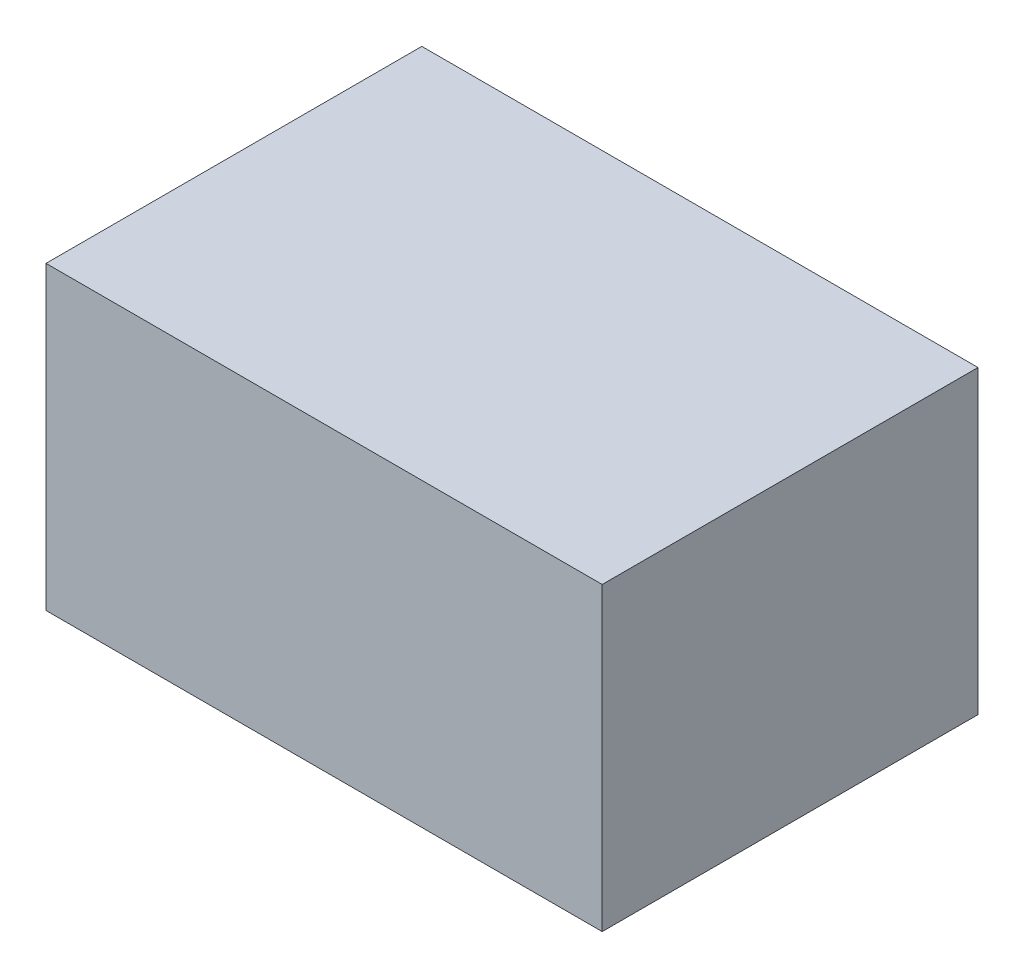
ISO-10303-21;
HEADER;
FILE_DESCRIPTION(('STEP AP214'),'2;1');
FILE_NAME('part.step','',(''),(''),'','','');
FILE_SCHEMA(('AUTOMOTIVE_DESIGN { 1 0 10303 214 1 1 1 1 }'));
ENDSEC;
DATA;
#1=APPLICATION_CONTEXT('core data for automotive mechanical design processes');
#2=APPLICATION_PROTOCOL_DEFINITION('international standard','automotive_design',2000,#1);
#3=PRODUCT_CONTEXT('',#1,'mechanical');
#4=PRODUCT('Part','Part','',(#3));
#5=PRODUCT_RELATED_PRODUCT_CATEGORY('part','',(#4));
#6=PRODUCT_DEFINITION_FORMATION('','',#4);
#7=PRODUCT_DEFINITION_CONTEXT('part definition',#1,'design');
#8=PRODUCT_DEFINITION('design','',#6,#7);
#9=PRODUCT_DEFINITION_SHAPE('','',#8);
#10=(LENGTH_UNIT() NAMED_UNIT(*) SI_UNIT(.MILLI.,.METRE.));
#11=(NAMED_UNIT(*) PLANE_ANGLE_UNIT() SI_UNIT($,.RADIAN.));
#12=(NAMED_UNIT(*) SI_UNIT($,.STERADIAN.) SOLID_ANGLE_UNIT());
#13=UNCERTAINTY_MEASURE_WITH_UNIT(LENGTH_MEASURE(1.E-05),#10,'distance_accuracy_value','');
#14=(GEOMETRIC_REPRESENTATION_CONTEXT(3) GLOBAL_UNCERTAINTY_ASSIGNED_CONTEXT((#13)) GLOBAL_UNIT_ASSIGNED_CONTEXT((#10,
#11,#12)) REPRESENTATION_CONTEXT('',''));
#15=CARTESIAN_POINT('',(0.,0.,0.));
#16=DIRECTION('',(0.,0.,1.));
#17=DIRECTION('',(1.,0.,0.));
#18=AXIS2_PLACEMENT_3D('',#15,#16,#17);
#19=CARTESIAN_POINT('',(37.,0.,0.));
#20=DIRECTION('',(0.,0.,-1.));
#21=DIRECTION('',(-1.,0.,0.));
#22=AXIS2_PLACEMENT_3D('',#19,#20,#21);
#23=PLANE('',#22);
#24=DIRECTION('',(0.,-1.,0.));
#25=VECTOR('',#24,1.);
#26=CARTESIAN_POINT('',(-37.,0.,0.));
#27=LINE('',#26,#25);
#28=CARTESIAN_POINT('',(-37.,40.,0.));
#29=VERTEX_POINT('',#28);
#30=CARTESIAN_POINT('',(-37.,0.,0.));
#31=VERTEX_POINT('',#30);
#32=EDGE_CURVE('E99',#29,#31,#27,.T.);
#33=ORIENTED_EDGE('',*,*,#32,.T.);
#34=DIRECTION('',(-1.,0.,0.));
#35=VECTOR('',#34,1.);
#36=CARTESIAN_POINT('',(37.,0.,0.));
#37=LINE('',#36,#35);
#38=CARTESIAN_POINT('',(37.,0.,0.));
#39=VERTEX_POINT('',#38);
#40=EDGE_CURVE('E11',#39,#31,#37,.T.);
#41=ORIENTED_EDGE('',*,*,#40,.F.);
#42=DIRECTION('',(0.,-1.,0.));
#43=VECTOR('',#42,1.);
#44=CARTESIAN_POINT('',(37.,0.,0.));
#45=LINE('',#44,#43);
#46=CARTESIAN_POINT('',(37.,40.,0.));
#47=VERTEX_POINT('',#46);
#48=EDGE_CURVE('E87',#47,#39,#45,.T.);
#49=ORIENTED_EDGE('',*,*,#48,.F.);
#50=DIRECTION('',(-1.,0.,0.));
#51=VECTOR('',#50,1.);
#52=CARTESIAN_POINT('',(37.,40.,0.));
#53=LINE('',#52,#51);
#54=EDGE_CURVE('E95',#47,#29,#53,.T.);
#55=ORIENTED_EDGE('',*,*,#54,.T.);
#56=EDGE_LOOP('',(#33,#41,#49,#55));
#57=FACE_BOUND('',#56,.T.);
#58=ADVANCED_FACE('F36',(#57),#23,.F.);
#59=CARTESIAN_POINT('',(37.,0.,0.));
#60=DIRECTION('',(0.,1.,0.));
#61=DIRECTION('',(0.,0.,1.));
#62=AXIS2_PLACEMENT_3D('',#59,#60,#61);
#63=PLANE('',#62);
#64=DIRECTION('',(0.,0.,-1.));
#65=VECTOR('',#64,1.);
#66=CARTESIAN_POINT('',(-37.,0.,0.));
#67=LINE('',#66,#65);
#68=CARTESIAN_POINT('',(-37.,0.,-50.));
#69=VERTEX_POINT('',#68);
#70=EDGE_CURVE('E91',#31,#69,#67,.T.);
#71=ORIENTED_EDGE('',*,*,#70,.T.);
#72=DIRECTION('',(-1.,0.,0.));
#73=VECTOR('',#72,1.);
#74=CARTESIAN_POINT('',(37.,0.,-50.));
#75=LINE('',#74,#73);
#76=CARTESIAN_POINT('',(37.,0.,-50.));
#77=VERTEX_POINT('',#76);
#78=EDGE_CURVE('E44',#77,#69,#75,.T.);
#79=ORIENTED_EDGE('',*,*,#78,.F.);
#80=DIRECTION('',(0.,0.,-1.));
#81=VECTOR('',#80,1.);
#82=CARTESIAN_POINT('',(37.,0.,0.));
#83=LINE('',#82,#81);
#84=EDGE_CURVE('E82',#39,#77,#83,.T.);
#85=ORIENTED_EDGE('',*,*,#84,.F.);
#86=ORIENTED_EDGE('',*,*,#40,.T.);
#87=EDGE_LOOP('',(#71,#79,#85,#86));
#88=FACE_BOUND('',#87,.T.);
#89=ADVANCED_FACE('F90',(#88),#63,.F.);
#90=CARTESIAN_POINT('',(37.,0.,-50.));
#91=DIRECTION('',(0.,0.,1.));
#92=DIRECTION('',(1.,0.,0.));
#93=AXIS2_PLACEMENT_3D('',#90,#91,#92);
#94=PLANE('',#93);
#95=DIRECTION('',(0.,1.,0.));
#96=VECTOR('',#95,1.);
#97=CARTESIAN_POINT('',(-37.,0.,-50.));
#98=LINE('',#97,#96);
#99=CARTESIAN_POINT('',(-37.,40.,-50.));
#100=VERTEX_POINT('',#99);
#101=EDGE_CURVE('E69',#69,#100,#98,.T.);
#102=ORIENTED_EDGE('',*,*,#101,.T.);
#103=DIRECTION('',(-1.,0.,0.));
#104=VECTOR('',#103,1.);
#105=CARTESIAN_POINT('',(37.,40.,-50.));
#106=LINE('',#105,#104);
#107=CARTESIAN_POINT('',(37.,40.,-50.));
#108=VERTEX_POINT('',#107);
#109=EDGE_CURVE('E92',#108,#100,#106,.T.);
#110=ORIENTED_EDGE('',*,*,#109,.F.);
#111=DIRECTION('',(0.,1.,0.));
#112=VECTOR('',#111,1.);
#113=CARTESIAN_POINT('',(37.,0.,-50.));
#114=LINE('',#113,#112);
#115=EDGE_CURVE('E85',#77,#108,#114,.T.);
#116=ORIENTED_EDGE('',*,*,#115,.F.);
#117=ORIENTED_EDGE('',*,*,#78,.T.);
#118=EDGE_LOOP('',(#102,#110,#116,#117));
#119=FACE_BOUND('',#118,.T.);
#120=ADVANCED_FACE('F93',(#119),#94,.F.);
#121=CARTESIAN_POINT('',(37.,40.,0.));
#122=DIRECTION('',(0.,-1.,0.));
#123=DIRECTION('',(0.,0.,-1.));
#124=AXIS2_PLACEMENT_3D('',#121,#122,#123);
#125=PLANE('',#124);
#126=DIRECTION('',(0.,0.,1.));
#127=VECTOR('',#126,1.);
#128=CARTESIAN_POINT('',(-37.,40.,0.));
#129=LINE('',#128,#127);
#130=EDGE_CURVE('E75',#100,#29,#129,.T.);
#131=ORIENTED_EDGE('',*,*,#130,.T.);
#132=ORIENTED_EDGE('',*,*,#54,.F.);
#133=DIRECTION('',(0.,0.,1.));
#134=VECTOR('',#133,1.);
#135=CARTESIAN_POINT('',(37.,40.,0.));
#136=LINE('',#135,#134);
#137=EDGE_CURVE('E52',#108,#47,#136,.T.);
#138=ORIENTED_EDGE('',*,*,#137,.F.);
#139=ORIENTED_EDGE('',*,*,#109,.T.);
#140=EDGE_LOOP('',(#131,#132,#138,#139));
#141=FACE_BOUND('',#140,.T.);
#142=ADVANCED_FACE('F106',(#141),#125,.F.);
#143=CARTESIAN_POINT('',(37.,0.,0.));
#144=DIRECTION('',(-1.,0.,0.));
#145=DIRECTION('',(0.,0.,1.));
#146=AXIS2_PLACEMENT_3D('',#143,#144,#145);
#147=PLANE('',#146);
#148=ORIENTED_EDGE('',*,*,#48,.T.);
#149=ORIENTED_EDGE('',*,*,#84,.T.);
#150=ORIENTED_EDGE('',*,*,#115,.T.);
#151=ORIENTED_EDGE('',*,*,#137,.T.);
#152=EDGE_LOOP('',(#148,#149,#150,#151));
#153=FACE_BOUND('',#152,.T.);
#154=ADVANCED_FACE('F83',(#153),#147,.F.);
#155=CARTESIAN_POINT('',(-37.,0.,0.));
#156=DIRECTION('',(-1.,0.,0.));
#157=DIRECTION('',(0.,0.,1.));
#158=AXIS2_PLACEMENT_3D('',#155,#156,#157);
#159=PLANE('',#158);
#160=ORIENTED_EDGE('',*,*,#32,.F.);
#161=ORIENTED_EDGE('',*,*,#130,.F.);
#162=ORIENTED_EDGE('',*,*,#101,.F.);
#163=ORIENTED_EDGE('',*,*,#70,.F.);
#164=EDGE_LOOP('',(#160,#161,#162,#163));
#165=FACE_BOUND('',#164,.T.);
#166=ADVANCED_FACE('F109',(#165),#159,.T.);
#167=CLOSED_SHELL('',(#58,#89,#120,#142,#154,#166));
#168=MANIFOLD_SOLID_BREP('B2',#167);
#169=ADVANCED_BREP_SHAPE_REPRESENTATION('',(#18,#168),#14);
#170=SHAPE_DEFINITION_REPRESENTATION(#9,#169);
ENDSEC;
END-ISO-10303-21;
